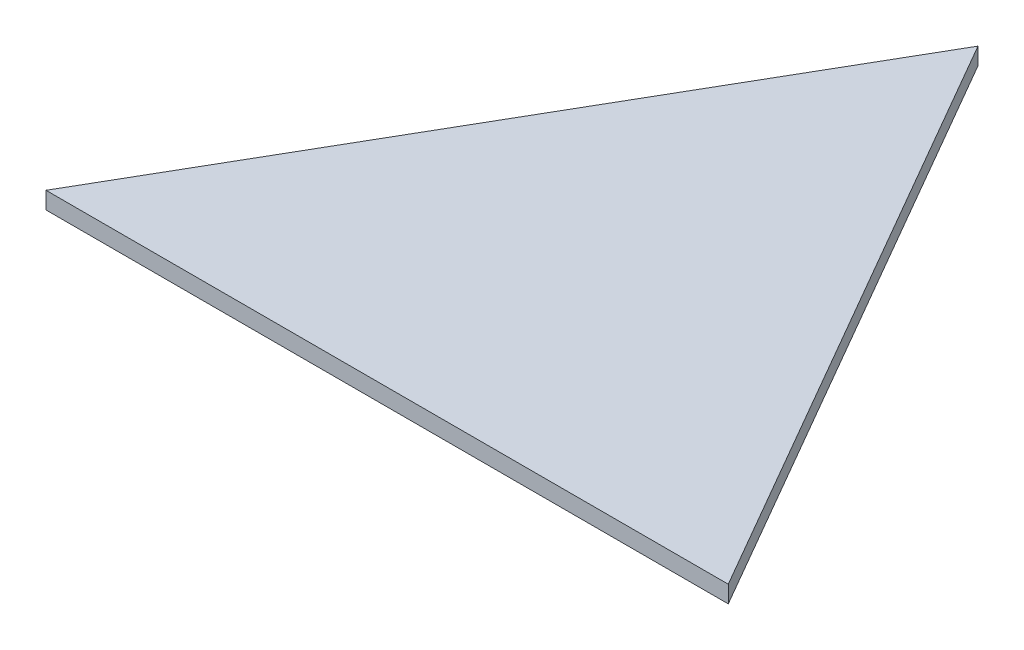
ISO-10303-21;
HEADER;
FILE_DESCRIPTION(('STEP AP214'),'2;1');
FILE_NAME('part.step','',(''),(''),'','','');
FILE_SCHEMA(('AUTOMOTIVE_DESIGN { 1 0 10303 214 1 1 1 1 }'));
ENDSEC;
DATA;
#1=APPLICATION_CONTEXT('core data for automotive mechanical design processes');
#2=APPLICATION_PROTOCOL_DEFINITION('international standard','automotive_design',2000,#1);
#3=PRODUCT_CONTEXT('',#1,'mechanical');
#4=PRODUCT('Part','Part','',(#3));
#5=PRODUCT_RELATED_PRODUCT_CATEGORY('part','',(#4));
#6=PRODUCT_DEFINITION_FORMATION('','',#4);
#7=PRODUCT_DEFINITION_CONTEXT('part definition',#1,'design');
#8=PRODUCT_DEFINITION('design','',#6,#7);
#9=PRODUCT_DEFINITION_SHAPE('','',#8);
#10=(LENGTH_UNIT() NAMED_UNIT(*) SI_UNIT(.MILLI.,.METRE.));
#11=(NAMED_UNIT(*) PLANE_ANGLE_UNIT() SI_UNIT($,.RADIAN.));
#12=(NAMED_UNIT(*) SI_UNIT($,.STERADIAN.) SOLID_ANGLE_UNIT());
#13=UNCERTAINTY_MEASURE_WITH_UNIT(LENGTH_MEASURE(1.E-05),#10,'distance_accuracy_value','');
#14=(GEOMETRIC_REPRESENTATION_CONTEXT(3) GLOBAL_UNCERTAINTY_ASSIGNED_CONTEXT((#13)) GLOBAL_UNIT_ASSIGNED_CONTEXT((#10,
#11,#12)) REPRESENTATION_CONTEXT('',''));
#15=CARTESIAN_POINT('',(0.,0.,0.));
#16=DIRECTION('',(0.,0.,1.));
#17=DIRECTION('',(1.,0.,0.));
#18=AXIS2_PLACEMENT_3D('',#15,#16,#17);
#19=CARTESIAN_POINT('',(127.,6.35,73.3234841870812));
#20=DIRECTION('',(-0.866025403784437,0.,0.500000000000002));
#21=DIRECTION('',(0.500000000000002,0.,0.866025403784437));
#22=AXIS2_PLACEMENT_3D('',#19,#20,#21);
#23=PLANE('',#22);
#24=DIRECTION('',(-0.500000000000002,0.,-0.866025403784437));
#25=VECTOR('',#24,1.);
#26=CARTESIAN_POINT('',(127.,0.,73.3234841870812));
#27=LINE('',#26,#25);
#28=CARTESIAN_POINT('',(127.,0.,73.3234841870812));
#29=VERTEX_POINT('',#28);
#30=CARTESIAN_POINT('',(0.,0.,-146.646968374165));
#31=VERTEX_POINT('',#30);
#32=EDGE_CURVE('E80',#29,#31,#27,.T.);
#33=ORIENTED_EDGE('',*,*,#32,.T.);
#34=DIRECTION('',(0.,-1.,0.));
#35=VECTOR('',#34,1.);
#36=CARTESIAN_POINT('',(0.,6.35,-146.646968374165));
#37=LINE('',#36,#35);
#38=CARTESIAN_POINT('',(0.,6.35,-146.646968374165));
#39=VERTEX_POINT('',#38);
#40=EDGE_CURVE('E11',#39,#31,#37,.T.);
#41=ORIENTED_EDGE('',*,*,#40,.F.);
#42=DIRECTION('',(-0.500000000000002,0.,-0.866025403784437));
#43=VECTOR('',#42,1.);
#44=CARTESIAN_POINT('',(127.,6.35,73.3234841870812));
#45=LINE('',#44,#43);
#46=CARTESIAN_POINT('',(127.,6.35,73.3234841870812));
#47=VERTEX_POINT('',#46);
#48=EDGE_CURVE('E73',#47,#39,#45,.T.);
#49=ORIENTED_EDGE('',*,*,#48,.F.);
#50=DIRECTION('',(0.,-1.,0.));
#51=VECTOR('',#50,1.);
#52=CARTESIAN_POINT('',(127.,6.35,73.3234841870812));
#53=LINE('',#52,#51);
#54=EDGE_CURVE('E81',#47,#29,#53,.T.);
#55=ORIENTED_EDGE('',*,*,#54,.T.);
#56=EDGE_LOOP('',(#33,#41,#49,#55));
#57=FACE_BOUND('',#56,.T.);
#58=ADVANCED_FACE('F33',(#57),#23,.F.);
#59=CARTESIAN_POINT('',(0.,6.35,-146.646968374165));
#60=DIRECTION('',(0.86602540378444,0.,0.499999999999998));
#61=DIRECTION('',(0.499999999999998,0.,-0.86602540378444));
#62=AXIS2_PLACEMENT_3D('',#59,#60,#61);
#63=PLANE('',#62);
#64=DIRECTION('',(-0.499999999999998,0.,0.86602540378444));
#65=VECTOR('',#64,1.);
#66=CARTESIAN_POINT('',(0.,0.,-146.646968374165));
#67=LINE('',#66,#65);
#68=CARTESIAN_POINT('',(-126.999999999999,0.,73.323484187083));
#69=VERTEX_POINT('',#68);
#70=EDGE_CURVE('E61',#31,#69,#67,.T.);
#71=ORIENTED_EDGE('',*,*,#70,.T.);
#72=DIRECTION('',(0.,-1.,0.));
#73=VECTOR('',#72,1.);
#74=CARTESIAN_POINT('',(-126.999999999999,6.35,73.323484187083));
#75=LINE('',#74,#73);
#76=CARTESIAN_POINT('',(-126.999999999999,6.35,73.323484187083));
#77=VERTEX_POINT('',#76);
#78=EDGE_CURVE('E41',#77,#69,#75,.T.);
#79=ORIENTED_EDGE('',*,*,#78,.F.);
#80=DIRECTION('',(-0.499999999999998,0.,0.86602540378444));
#81=VECTOR('',#80,1.);
#82=CARTESIAN_POINT('',(0.,6.35,-146.646968374165));
#83=LINE('',#82,#81);
#84=EDGE_CURVE('E69',#39,#77,#83,.T.);
#85=ORIENTED_EDGE('',*,*,#84,.F.);
#86=ORIENTED_EDGE('',*,*,#40,.T.);
#87=EDGE_LOOP('',(#71,#79,#85,#86));
#88=FACE_BOUND('',#87,.T.);
#89=ADVANCED_FACE('F70',(#88),#63,.F.);
#90=CARTESIAN_POINT('',(-126.999999999999,6.35,73.323484187083));
#91=DIRECTION('',(0.,0.,-1.));
#92=DIRECTION('',(-1.,0.,0.));
#93=AXIS2_PLACEMENT_3D('',#90,#91,#92);
#94=PLANE('',#93);
#95=DIRECTION('',(1.,0.,0.));
#96=VECTOR('',#95,1.);
#97=CARTESIAN_POINT('',(-126.999999999999,0.,73.323484187083));
#98=LINE('',#97,#96);
#99=EDGE_CURVE('E66',#69,#29,#98,.T.);
#100=ORIENTED_EDGE('',*,*,#99,.T.);
#101=ORIENTED_EDGE('',*,*,#54,.F.);
#102=DIRECTION('',(1.,0.,0.));
#103=VECTOR('',#102,1.);
#104=CARTESIAN_POINT('',(-126.999999999999,6.35,73.323484187083));
#105=LINE('',#104,#103);
#106=EDGE_CURVE('E49',#77,#47,#105,.T.);
#107=ORIENTED_EDGE('',*,*,#106,.F.);
#108=ORIENTED_EDGE('',*,*,#78,.T.);
#109=EDGE_LOOP('',(#100,#101,#107,#108));
#110=FACE_BOUND('',#109,.T.);
#111=ADVANCED_FACE('F88',(#110),#94,.F.);
#112=CARTESIAN_POINT('',(0.,6.35,0.));
#113=DIRECTION('',(0.,1.,0.));
#114=DIRECTION('',(0.,0.,1.));
#115=AXIS2_PLACEMENT_3D('',#112,#113,#114);
#116=PLANE('',#115);
#117=ORIENTED_EDGE('',*,*,#48,.T.);
#118=ORIENTED_EDGE('',*,*,#84,.T.);
#119=ORIENTED_EDGE('',*,*,#106,.T.);
#120=EDGE_LOOP('',(#117,#118,#119));
#121=FACE_BOUND('',#120,.T.);
#122=ADVANCED_FACE('F76',(#121),#116,.T.);
#123=CARTESIAN_POINT('',(0.,0.,0.));
#124=DIRECTION('',(0.,1.,0.));
#125=DIRECTION('',(0.,0.,1.));
#126=AXIS2_PLACEMENT_3D('',#123,#124,#125);
#127=PLANE('',#126);
#128=ORIENTED_EDGE('',*,*,#32,.F.);
#129=ORIENTED_EDGE('',*,*,#99,.F.);
#130=ORIENTED_EDGE('',*,*,#70,.F.);
#131=EDGE_LOOP('',(#128,#129,#130));
#132=FACE_BOUND('',#131,.T.);
#133=ADVANCED_FACE('F89',(#132),#127,.F.);
#134=CLOSED_SHELL('',(#58,#89,#111,#122,#133));
#135=MANIFOLD_SOLID_BREP('B2',#134);
#136=ADVANCED_BREP_SHAPE_REPRESENTATION('',(#18,#135),#14);
#137=SHAPE_DEFINITION_REPRESENTATION(#9,#136);
ENDSEC;
END-ISO-10303-21;
